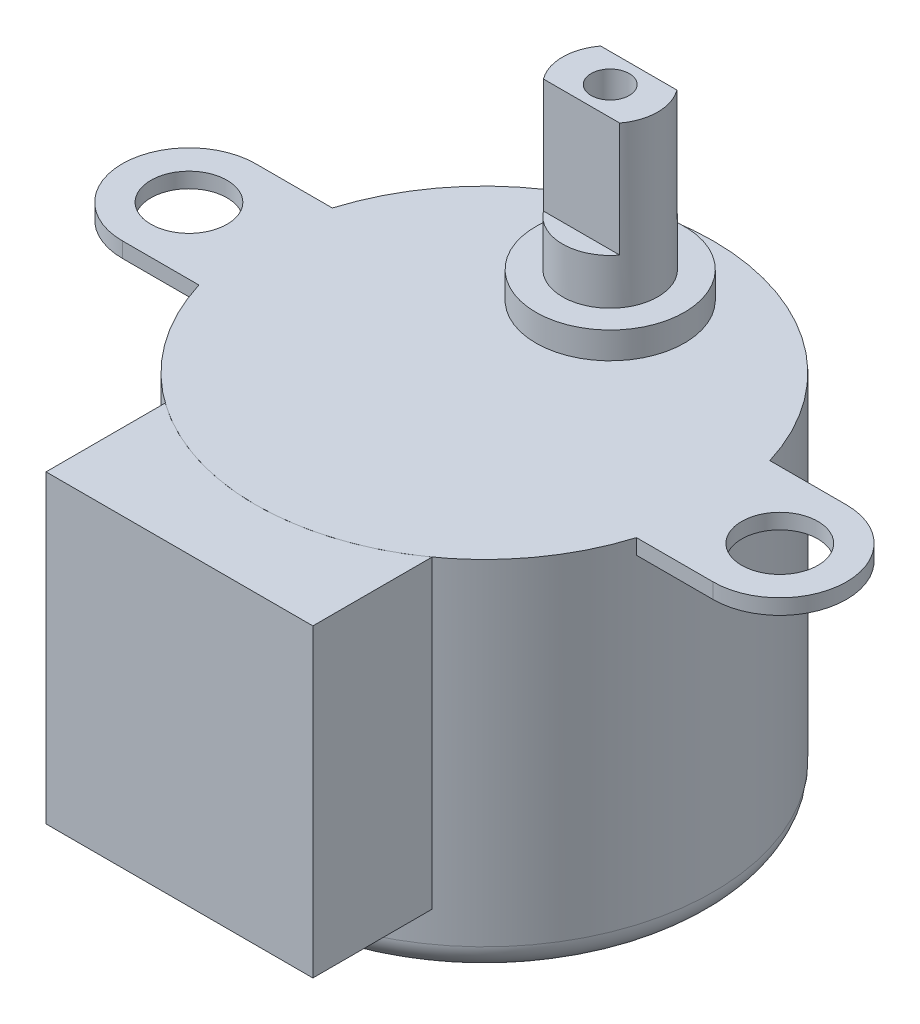
ISO-10303-21;
HEADER;
FILE_DESCRIPTION(('STEP AP214'),'2;1');
FILE_NAME('part.step','',(''),(''),'','','');
FILE_SCHEMA(('AUTOMOTIVE_DESIGN { 1 0 10303 214 1 1 1 1 }'));
ENDSEC;
DATA;
#1=APPLICATION_CONTEXT('core data for automotive mechanical design processes');
#2=APPLICATION_PROTOCOL_DEFINITION('international standard','automotive_design',2000,#1);
#3=PRODUCT_CONTEXT('',#1,'mechanical');
#4=PRODUCT('Part','Part','',(#3));
#5=PRODUCT_RELATED_PRODUCT_CATEGORY('part','',(#4));
#6=PRODUCT_DEFINITION_FORMATION('','',#4);
#7=PRODUCT_DEFINITION_CONTEXT('part definition',#1,'design');
#8=PRODUCT_DEFINITION('design','',#6,#7);
#9=PRODUCT_DEFINITION_SHAPE('','',#8);
#10=(LENGTH_UNIT() NAMED_UNIT(*) SI_UNIT(.MILLI.,.METRE.));
#11=(NAMED_UNIT(*) PLANE_ANGLE_UNIT() SI_UNIT($,.RADIAN.));
#12=(NAMED_UNIT(*) SI_UNIT($,.STERADIAN.) SOLID_ANGLE_UNIT());
#13=UNCERTAINTY_MEASURE_WITH_UNIT(LENGTH_MEASURE(1.E-05),#10,'distance_accuracy_value','');
#14=(GEOMETRIC_REPRESENTATION_CONTEXT(3) GLOBAL_UNCERTAINTY_ASSIGNED_CONTEXT((#13)) GLOBAL_UNIT_ASSIGNED_CONTEXT((#10,
#11,#12)) REPRESENTATION_CONTEXT('',''));
#15=CARTESIAN_POINT('',(0.,0.,0.));
#16=DIRECTION('',(0.,0.,1.));
#17=DIRECTION('',(1.,0.,0.));
#18=AXIS2_PLACEMENT_3D('',#15,#16,#17);
#19=CARTESIAN_POINT('',(0.,28.8,-6.6));
#20=DIRECTION('',(0.,-1.,0.));
#21=DIRECTION('',(0.,0.,-1.));
#22=AXIS2_PLACEMENT_3D('',#19,#20,#21);
#23=CYLINDRICAL_SURFACE('',#22,2.5);
#24=CARTESIAN_POINT('',(0.,28.8,-6.6));
#25=DIRECTION('',(0.,1.,0.));
#26=DIRECTION('',(0.,0.,1.));
#27=AXIS2_PLACEMENT_3D('',#24,#25,#26);
#28=CIRCLE('',#27,2.5);
#29=CARTESIAN_POINT('',(-2.,28.8,-8.1));
#30=VERTEX_POINT('',#29);
#31=CARTESIAN_POINT('',(-2.,28.8,-5.1));
#32=VERTEX_POINT('',#31);
#33=EDGE_CURVE('E52',#30,#32,#28,.T.);
#34=ORIENTED_EDGE('',*,*,#33,.F.);
#35=DIRECTION('',(0.,1.,0.));
#36=VECTOR('',#35,1.);
#37=CARTESIAN_POINT('',(-2.,22.8,-8.1));
#38=LINE('',#37,#36);
#39=CARTESIAN_POINT('',(-2.,22.8,-8.1));
#40=VERTEX_POINT('',#39);
#41=EDGE_CURVE('E59',#40,#30,#38,.T.);
#42=ORIENTED_EDGE('',*,*,#41,.F.);
#43=CARTESIAN_POINT('',(0.,22.8,-6.6));
#44=DIRECTION('',(0.,1.,0.));
#45=DIRECTION('',(0.,0.,1.));
#46=AXIS2_PLACEMENT_3D('',#43,#44,#45);
#47=CIRCLE('',#46,2.5);
#48=CARTESIAN_POINT('',(2.,22.8,-8.1));
#49=VERTEX_POINT('',#48);
#50=EDGE_CURVE('E86',#49,#40,#47,.T.);
#51=ORIENTED_EDGE('',*,*,#50,.F.);
#52=DIRECTION('',(0.,1.,0.));
#53=VECTOR('',#52,1.);
#54=CARTESIAN_POINT('',(2.,22.8,-8.1));
#55=LINE('',#54,#53);
#56=CARTESIAN_POINT('',(2.,28.8,-8.1));
#57=VERTEX_POINT('',#56);
#58=EDGE_CURVE('E94',#49,#57,#55,.T.);
#59=ORIENTED_EDGE('',*,*,#58,.T.);
#60=CARTESIAN_POINT('',(2.,28.8,-5.1));
#61=VERTEX_POINT('',#60);
#62=EDGE_CURVE('E12',#61,#57,#28,.T.);
#63=ORIENTED_EDGE('',*,*,#62,.F.);
#64=DIRECTION('',(0.,1.,0.));
#65=VECTOR('',#64,1.);
#66=CARTESIAN_POINT('',(2.,22.8,-5.1));
#67=LINE('',#66,#65);
#68=CARTESIAN_POINT('',(2.,22.8,-5.1));
#69=VERTEX_POINT('',#68);
#70=EDGE_CURVE('E67',#69,#61,#67,.T.);
#71=ORIENTED_EDGE('',*,*,#70,.F.);
#72=CARTESIAN_POINT('',(0.,22.8,-6.6));
#73=DIRECTION('',(0.,1.,0.));
#74=DIRECTION('',(0.,0.,1.));
#75=AXIS2_PLACEMENT_3D('',#72,#73,#74);
#76=CIRCLE('',#75,2.5);
#77=CARTESIAN_POINT('',(-2.,22.8,-5.1));
#78=VERTEX_POINT('',#77);
#79=EDGE_CURVE('E106',#78,#69,#76,.T.);
#80=ORIENTED_EDGE('',*,*,#79,.F.);
#81=DIRECTION('',(0.,1.,0.));
#82=VECTOR('',#81,1.);
#83=CARTESIAN_POINT('',(-2.,22.8,-5.1));
#84=LINE('',#83,#82);
#85=EDGE_CURVE('E110',#78,#32,#84,.T.);
#86=ORIENTED_EDGE('',*,*,#85,.T.);
#87=EDGE_LOOP('',(#34,#42,#51,#59,#63,#71,#80,#86));
#88=FACE_BOUND('',#87,.T.);
#89=CARTESIAN_POINT('',(0.,20.4,-6.6));
#90=DIRECTION('',(0.,1.,0.));
#91=DIRECTION('',(0.,0.,1.));
#92=AXIS2_PLACEMENT_3D('',#89,#90,#91);
#93=CIRCLE('',#92,2.5);
#94=CARTESIAN_POINT('',(0.,20.4,-4.1));
#95=VERTEX_POINT('',#94);
#96=EDGE_CURVE('E47',#95,#95,#93,.T.);
#97=ORIENTED_EDGE('',*,*,#96,.T.);
#98=EDGE_LOOP('',(#97));
#99=FACE_BOUND('',#98,.T.);
#100=ADVANCED_FACE('F44',(#88,#99),#23,.T.);
#101=CARTESIAN_POINT('',(0.,28.8,-6.6));
#102=DIRECTION('',(0.,1.,0.));
#103=DIRECTION('',(0.,0.,1.));
#104=AXIS2_PLACEMENT_3D('',#101,#102,#103);
#105=PLANE('',#104);
#106=CARTESIAN_POINT('',(0.,28.8,-6.6));
#107=DIRECTION('',(0.,1.,0.));
#108=DIRECTION('',(0.,0.,1.));
#109=AXIS2_PLACEMENT_3D('',#106,#107,#108);
#110=CIRCLE('',#109,1.);
#111=CARTESIAN_POINT('',(0.,28.8,-5.6));
#112=VERTEX_POINT('',#111);
#113=EDGE_CURVE('E200',#112,#112,#110,.T.);
#114=ORIENTED_EDGE('',*,*,#113,.F.);
#115=EDGE_LOOP('',(#114));
#116=FACE_BOUND('',#115,.T.);
#117=DIRECTION('',(1.,0.,0.));
#118=VECTOR('',#117,1.);
#119=CARTESIAN_POINT('',(0.,28.8,-8.1));
#120=LINE('',#119,#118);
#121=EDGE_CURVE('E91',#30,#57,#120,.T.);
#122=ORIENTED_EDGE('',*,*,#121,.F.);
#123=ORIENTED_EDGE('',*,*,#33,.T.);
#124=DIRECTION('',(1.,0.,0.));
#125=VECTOR('',#124,1.);
#126=CARTESIAN_POINT('',(0.,28.8,-5.1));
#127=LINE('',#126,#125);
#128=EDGE_CURVE('E107',#32,#61,#127,.T.);
#129=ORIENTED_EDGE('',*,*,#128,.T.);
#130=ORIENTED_EDGE('',*,*,#62,.T.);
#131=EDGE_LOOP('',(#122,#123,#129,#130));
#132=FACE_BOUND('',#131,.T.);
#133=ADVANCED_FACE('F117',(#116,#132),#105,.T.);
#134=CARTESIAN_POINT('',(0.,20.4,-6.6));
#135=DIRECTION('',(0.,1.,0.));
#136=DIRECTION('',(0.,0.,1.));
#137=AXIS2_PLACEMENT_3D('',#134,#135,#136);
#138=PLANE('',#137);
#139=ORIENTED_EDGE('',*,*,#96,.F.);
#140=EDGE_LOOP('',(#139));
#141=FACE_BOUND('',#140,.T.);
#142=ADVANCED_FACE('F122',(#141),#138,.F.);
#143=CARTESIAN_POINT('',(0.,22.8,-5.1));
#144=DIRECTION('',(0.,0.,1.));
#145=DIRECTION('',(1.,0.,0.));
#146=AXIS2_PLACEMENT_3D('',#143,#144,#145);
#147=PLANE('',#146);
#148=ORIENTED_EDGE('',*,*,#128,.F.);
#149=ORIENTED_EDGE('',*,*,#85,.F.);
#150=DIRECTION('',(1.,0.,0.));
#151=VECTOR('',#150,1.);
#152=CARTESIAN_POINT('',(0.,22.8,-5.1));
#153=LINE('',#152,#151);
#154=EDGE_CURVE('E104',#78,#69,#153,.T.);
#155=ORIENTED_EDGE('',*,*,#154,.T.);
#156=ORIENTED_EDGE('',*,*,#70,.T.);
#157=EDGE_LOOP('',(#148,#149,#155,#156));
#158=FACE_BOUND('',#157,.T.);
#159=ADVANCED_FACE('F124',(#158),#147,.T.);
#160=CARTESIAN_POINT('',(0.,22.8,0.));
#161=DIRECTION('',(0.,1.,0.));
#162=DIRECTION('',(0.,0.,1.));
#163=AXIS2_PLACEMENT_3D('',#160,#161,#162);
#164=PLANE('',#163);
#165=ORIENTED_EDGE('',*,*,#154,.F.);
#166=ORIENTED_EDGE('',*,*,#79,.T.);
#167=EDGE_LOOP('',(#165,#166));
#168=FACE_BOUND('',#167,.T.);
#169=ADVANCED_FACE('F129',(#168),#164,.T.);
#170=CARTESIAN_POINT('',(0.,22.8,-8.1));
#171=DIRECTION('',(0.,0.,1.));
#172=DIRECTION('',(1.,0.,0.));
#173=AXIS2_PLACEMENT_3D('',#170,#171,#172);
#174=PLANE('',#173);
#175=ORIENTED_EDGE('',*,*,#121,.T.);
#176=ORIENTED_EDGE('',*,*,#58,.F.);
#177=DIRECTION('',(1.,0.,0.));
#178=VECTOR('',#177,1.);
#179=CARTESIAN_POINT('',(0.,22.8,-8.1));
#180=LINE('',#179,#178);
#181=EDGE_CURVE('E88',#40,#49,#180,.T.);
#182=ORIENTED_EDGE('',*,*,#181,.F.);
#183=ORIENTED_EDGE('',*,*,#41,.T.);
#184=EDGE_LOOP('',(#175,#176,#182,#183));
#185=FACE_BOUND('',#184,.T.);
#186=ADVANCED_FACE('F93',(#185),#174,.F.);
#187=CARTESIAN_POINT('',(0.,22.8,0.));
#188=DIRECTION('',(0.,1.,0.));
#189=DIRECTION('',(0.,0.,1.));
#190=AXIS2_PLACEMENT_3D('',#187,#188,#189);
#191=PLANE('',#190);
#192=ORIENTED_EDGE('',*,*,#50,.T.);
#193=ORIENTED_EDGE('',*,*,#181,.T.);
#194=EDGE_LOOP('',(#192,#193));
#195=FACE_BOUND('',#194,.T.);
#196=ADVANCED_FACE('F87',(#195),#191,.T.);
#197=CARTESIAN_POINT('',(0.,22.8,-6.6));
#198=DIRECTION('',(0.,1.,0.));
#199=DIRECTION('',(0.,0.,1.));
#200=AXIS2_PLACEMENT_3D('',#197,#198,#199);
#201=CYLINDRICAL_SURFACE('',#200,1.);
#202=CARTESIAN_POINT('',(0.,22.8,-6.6));
#203=DIRECTION('',(0.,1.,0.));
#204=DIRECTION('',(0.,0.,1.));
#205=AXIS2_PLACEMENT_3D('',#202,#203,#204);
#206=CIRCLE('',#205,1.);
#207=CARTESIAN_POINT('',(0.,22.8,-5.6));
#208=VERTEX_POINT('',#207);
#209=EDGE_CURVE('E112',#208,#208,#206,.T.);
#210=ORIENTED_EDGE('',*,*,#209,.F.);
#211=EDGE_LOOP('',(#210));
#212=FACE_BOUND('',#211,.T.);
#213=ORIENTED_EDGE('',*,*,#113,.T.);
#214=EDGE_LOOP('',(#213));
#215=FACE_BOUND('',#214,.T.);
#216=ADVANCED_FACE('F152',(#212,#215),#201,.F.);
#217=CARTESIAN_POINT('',(0.,22.8,-6.6));
#218=DIRECTION('',(0.,1.,0.));
#219=DIRECTION('',(0.,0.,1.));
#220=AXIS2_PLACEMENT_3D('',#217,#218,#219);
#221=PLANE('',#220);
#222=ORIENTED_EDGE('',*,*,#209,.T.);
#223=EDGE_LOOP('',(#222));
#224=FACE_BOUND('',#223,.T.);
#225=ADVANCED_FACE('F157',(#224),#221,.T.);
#226=CLOSED_SHELL('',(#100,#133,#142,#159,#169,#186,#196,#216,#225));
#227=MANIFOLD_SOLID_BREP('B2',#226);
#228=CARTESIAN_POINT('',(7.,3.,0.));
#229=DIRECTION('',(-1.,0.,0.));
#230=DIRECTION('',(0.,0.,1.));
#231=AXIS2_PLACEMENT_3D('',#228,#229,#230);
#232=PLANE('',#231);
#233=DIRECTION('',(0.,0.,1.));
#234=VECTOR('',#233,1.);
#235=CARTESIAN_POINT('',(7.,19.,0.));
#236=LINE('',#235,#234);
#237=CARTESIAN_POINT('',(7.,19.,9.74679434480896));
#238=VERTEX_POINT('',#237);
#239=CARTESIAN_POINT('',(7.,19.,16.));
#240=VERTEX_POINT('',#239);
#241=EDGE_CURVE('E283',#238,#240,#236,.T.);
#242=ORIENTED_EDGE('',*,*,#241,.T.);
#243=DIRECTION('',(0.,1.,0.));
#244=VECTOR('',#243,1.);
#245=CARTESIAN_POINT('',(7.,3.,16.));
#246=LINE('',#245,#244);
#247=CARTESIAN_POINT('',(7.,3.,16.));
#248=VERTEX_POINT('',#247);
#249=EDGE_CURVE('E42',#248,#240,#246,.T.);
#250=ORIENTED_EDGE('',*,*,#249,.F.);
#251=DIRECTION('',(0.,0.,1.));
#252=VECTOR('',#251,1.);
#253=CARTESIAN_POINT('',(7.,3.,0.));
#254=LINE('',#253,#252);
#255=CARTESIAN_POINT('',(7.,3.,9.74679434480896));
#256=VERTEX_POINT('',#255);
#257=EDGE_CURVE('E239',#256,#248,#254,.T.);
#258=ORIENTED_EDGE('',*,*,#257,.F.);
#259=DIRECTION('',(0.,1.,0.));
#260=VECTOR('',#259,1.);
#261=CARTESIAN_POINT('',(7.,3.,9.74679434480896));
#262=LINE('',#261,#260);
#263=EDGE_CURVE('E224',#256,#238,#262,.T.);
#264=ORIENTED_EDGE('',*,*,#263,.T.);
#265=EDGE_LOOP('',(#242,#250,#258,#264));
#266=FACE_BOUND('',#265,.T.);
#267=ADVANCED_FACE('F221',(#266),#232,.F.);
#268=CARTESIAN_POINT('',(0.,3.,16.));
#269=DIRECTION('',(0.,0.,1.));
#270=DIRECTION('',(1.,0.,0.));
#271=AXIS2_PLACEMENT_3D('',#268,#269,#270);
#272=PLANE('',#271);
#273=DIRECTION('',(1.,0.,0.));
#274=VECTOR('',#273,1.);
#275=CARTESIAN_POINT('',(0.,19.,16.));
#276=LINE('',#275,#274);
#277=CARTESIAN_POINT('',(-7.,19.,16.));
#278=VERTEX_POINT('',#277);
#279=EDGE_CURVE('E288',#278,#240,#276,.T.);
#280=ORIENTED_EDGE('',*,*,#279,.F.);
#281=DIRECTION('',(0.,1.,0.));
#282=VECTOR('',#281,1.);
#283=CARTESIAN_POINT('',(-7.,3.,16.));
#284=LINE('',#283,#282);
#285=CARTESIAN_POINT('',(-7.,3.,16.));
#286=VERTEX_POINT('',#285);
#287=EDGE_CURVE('E230',#286,#278,#284,.T.);
#288=ORIENTED_EDGE('',*,*,#287,.F.);
#289=DIRECTION('',(1.,0.,0.));
#290=VECTOR('',#289,1.);
#291=CARTESIAN_POINT('',(0.,3.,16.));
#292=LINE('',#291,#290);
#293=EDGE_CURVE('E278',#286,#248,#292,.T.);
#294=ORIENTED_EDGE('',*,*,#293,.T.);
#295=ORIENTED_EDGE('',*,*,#249,.T.);
#296=EDGE_LOOP('',(#280,#288,#294,#295));
#297=FACE_BOUND('',#296,.T.);
#298=ADVANCED_FACE('F294',(#297),#272,.T.);
#299=CARTESIAN_POINT('',(-7.,3.,0.));
#300=DIRECTION('',(-1.,0.,0.));
#301=DIRECTION('',(0.,0.,1.));
#302=AXIS2_PLACEMENT_3D('',#299,#300,#301);
#303=PLANE('',#302);
#304=DIRECTION('',(0.,0.,1.));
#305=VECTOR('',#304,1.);
#306=CARTESIAN_POINT('',(-7.,19.,0.));
#307=LINE('',#306,#305);
#308=CARTESIAN_POINT('',(-7.,19.,9.74679434480896));
#309=VERTEX_POINT('',#308);
#310=EDGE_CURVE('E271',#309,#278,#307,.T.);
#311=ORIENTED_EDGE('',*,*,#310,.F.);
#312=DIRECTION('',(0.,1.,0.));
#313=VECTOR('',#312,1.);
#314=CARTESIAN_POINT('',(-7.,3.,9.74679434480896));
#315=LINE('',#314,#313);
#316=CARTESIAN_POINT('',(-7.,3.,9.74679434480896));
#317=VERTEX_POINT('',#316);
#318=EDGE_CURVE('E268',#317,#309,#315,.T.);
#319=ORIENTED_EDGE('',*,*,#318,.F.);
#320=DIRECTION('',(0.,0.,1.));
#321=VECTOR('',#320,1.);
#322=CARTESIAN_POINT('',(-7.,3.,0.));
#323=LINE('',#322,#321);
#324=EDGE_CURVE('E270',#317,#286,#323,.T.);
#325=ORIENTED_EDGE('',*,*,#324,.T.);
#326=ORIENTED_EDGE('',*,*,#287,.T.);
#327=EDGE_LOOP('',(#311,#319,#325,#326));
#328=FACE_BOUND('',#327,.T.);
#329=ADVANCED_FACE('F269',(#328),#303,.T.);
#330=CARTESIAN_POINT('',(0.,3.,0.));
#331=DIRECTION('',(0.,1.,0.));
#332=DIRECTION('',(0.,0.,1.));
#333=AXIS2_PLACEMENT_3D('',#330,#331,#332);
#334=CYLINDRICAL_SURFACE('',#333,12.);
#335=CARTESIAN_POINT('',(0.,19.,0.));
#336=DIRECTION('',(0.,1.,0.));
#337=DIRECTION('',(0.,0.,1.));
#338=AXIS2_PLACEMENT_3D('',#335,#336,#337);
#339=CIRCLE('',#338,12.);
#340=EDGE_CURVE('E285',#309,#238,#339,.T.);
#341=ORIENTED_EDGE('',*,*,#340,.T.);
#342=ORIENTED_EDGE('',*,*,#263,.F.);
#343=CARTESIAN_POINT('',(0.,3.,0.));
#344=DIRECTION('',(0.,1.,0.));
#345=DIRECTION('',(0.,0.,1.));
#346=AXIS2_PLACEMENT_3D('',#343,#344,#345);
#347=CIRCLE('',#346,12.);
#348=EDGE_CURVE('E265',#317,#256,#347,.T.);
#349=ORIENTED_EDGE('',*,*,#348,.F.);
#350=ORIENTED_EDGE('',*,*,#318,.T.);
#351=EDGE_LOOP('',(#341,#342,#349,#350));
#352=FACE_BOUND('',#351,.T.);
#353=ADVANCED_FACE('F274',(#352),#334,.F.);
#354=CARTESIAN_POINT('',(0.,3.,0.));
#355=DIRECTION('',(0.,1.,0.));
#356=DIRECTION('',(0.,0.,1.));
#357=AXIS2_PLACEMENT_3D('',#354,#355,#356);
#358=PLANE('',#357);
#359=ORIENTED_EDGE('',*,*,#257,.T.);
#360=ORIENTED_EDGE('',*,*,#293,.F.);
#361=ORIENTED_EDGE('',*,*,#324,.F.);
#362=ORIENTED_EDGE('',*,*,#348,.T.);
#363=EDGE_LOOP('',(#359,#360,#361,#362));
#364=FACE_BOUND('',#363,.T.);
#365=ADVANCED_FACE('F277',(#364),#358,.F.);
#366=CARTESIAN_POINT('',(0.,19.,0.));
#367=DIRECTION('',(0.,1.,0.));
#368=DIRECTION('',(0.,0.,1.));
#369=AXIS2_PLACEMENT_3D('',#366,#367,#368);
#370=PLANE('',#369);
#371=ORIENTED_EDGE('',*,*,#241,.F.);
#372=ORIENTED_EDGE('',*,*,#340,.F.);
#373=ORIENTED_EDGE('',*,*,#310,.T.);
#374=ORIENTED_EDGE('',*,*,#279,.T.);
#375=EDGE_LOOP('',(#371,#372,#373,#374));
#376=FACE_BOUND('',#375,.T.);
#377=ADVANCED_FACE('F293',(#376),#370,.T.);
#378=CLOSED_SHELL('',(#267,#298,#329,#353,#365,#377));
#379=MANIFOLD_SOLID_BREP('B6',#378);
#380=CARTESIAN_POINT('',(0.,19.,0.));
#381=DIRECTION('',(0.,-1.,0.));
#382=DIRECTION('',(0.,0.,-1.));
#383=AXIS2_PLACEMENT_3D('',#380,#381,#382);
#384=CYLINDRICAL_SURFACE('',#383,12.);
#385=CARTESIAN_POINT('',(0.,1.4,0.));
#386=DIRECTION('',(0.,1.,0.));
#387=DIRECTION('',(0.,0.,1.));
#388=AXIS2_PLACEMENT_3D('',#385,#386,#387);
#389=CIRCLE('',#388,12.);
#390=CARTESIAN_POINT('',(0.,1.4,12.));
#391=VERTEX_POINT('',#390);
#392=EDGE_CURVE('E353',#391,#391,#389,.T.);
#393=ORIENTED_EDGE('',*,*,#392,.T.);
#394=EDGE_LOOP('',(#393));
#395=FACE_BOUND('',#394,.T.);
#396=DIRECTION('',(0.,-1.,0.));
#397=VECTOR('',#396,1.);
#398=CARTESIAN_POINT('',(11.478240283249,19.,-3.50000000000001));
#399=LINE('',#398,#397);
#400=CARTESIAN_POINT('',(11.478240283249,18.2,-3.50000000000001));
#401=VERTEX_POINT('',#400);
#402=CARTESIAN_POINT('',(11.478240283249,19.,-3.50000000000001));
#403=VERTEX_POINT('',#402);
#404=EDGE_CURVE('E464',#401,#403,#399,.F.);
#405=ORIENTED_EDGE('',*,*,#404,.F.);
#406=CARTESIAN_POINT('',(0.,18.2,0.));
#407=DIRECTION('',(0.,1.,0.));
#408=DIRECTION('',(0.,0.,1.));
#409=AXIS2_PLACEMENT_3D('',#406,#407,#408);
#410=CIRCLE('',#409,12.);
#411=CARTESIAN_POINT('',(11.478240283249,18.2,3.50000000000001));
#412=VERTEX_POINT('',#411);
#413=EDGE_CURVE('E472',#412,#401,#410,.T.);
#414=ORIENTED_EDGE('',*,*,#413,.F.);
#415=DIRECTION('',(0.,-1.,0.));
#416=VECTOR('',#415,1.);
#417=CARTESIAN_POINT('',(11.478240283249,19.,3.50000000000001));
#418=LINE('',#417,#416);
#419=CARTESIAN_POINT('',(11.478240283249,19.,3.50000000000001));
#420=VERTEX_POINT('',#419);
#421=EDGE_CURVE('E454',#412,#420,#418,.F.);
#422=ORIENTED_EDGE('',*,*,#421,.T.);
#423=CARTESIAN_POINT('',(0.,19.,0.));
#424=DIRECTION('',(0.,1.,0.));
#425=DIRECTION('',(0.,0.,1.));
#426=AXIS2_PLACEMENT_3D('',#423,#424,#425);
#427=CIRCLE('',#426,12.);
#428=CARTESIAN_POINT('',(-11.478240283249,19.,3.50000000000001));
#429=VERTEX_POINT('',#428);
#430=EDGE_CURVE('E468',#429,#420,#427,.T.);
#431=ORIENTED_EDGE('',*,*,#430,.F.);
#432=DIRECTION('',(0.,-1.,0.));
#433=VECTOR('',#432,1.);
#434=CARTESIAN_POINT('',(-11.478240283249,19.,3.50000000000001));
#435=LINE('',#434,#433);
#436=CARTESIAN_POINT('',(-11.478240283249,18.2,3.50000000000001));
#437=VERTEX_POINT('',#436);
#438=EDGE_CURVE('E462',#429,#437,#435,.T.);
#439=ORIENTED_EDGE('',*,*,#438,.T.);
#440=CARTESIAN_POINT('',(-11.478240283249,18.2,-3.49999999999999));
#441=VERTEX_POINT('',#440);
#442=EDGE_CURVE('E428',#441,#437,#410,.T.);
#443=ORIENTED_EDGE('',*,*,#442,.F.);
#444=DIRECTION('',(0.,-1.,0.));
#445=VECTOR('',#444,1.);
#446=CARTESIAN_POINT('',(-11.478240283249,19.,-3.49999999999999));
#447=LINE('',#446,#445);
#448=CARTESIAN_POINT('',(-11.478240283249,19.,-3.49999999999999));
#449=VERTEX_POINT('',#448);
#450=EDGE_CURVE('E466',#449,#441,#447,.T.);
#451=ORIENTED_EDGE('',*,*,#450,.F.);
#452=EDGE_CURVE('E470',#403,#449,#427,.T.);
#453=ORIENTED_EDGE('',*,*,#452,.F.);
#454=EDGE_LOOP('',(#405,#414,#422,#431,#439,#443,#451,#453));
#455=FACE_BOUND('',#454,.T.);
#456=ADVANCED_FACE('F345',(#395,#455),#384,.T.);
#457=CARTESIAN_POINT('',(0.,19.,0.));
#458=DIRECTION('',(0.,1.,0.));
#459=DIRECTION('',(0.,0.,1.));
#460=AXIS2_PLACEMENT_3D('',#457,#458,#459);
#461=PLANE('',#460);
#462=CARTESIAN_POINT('',(0.,19.,-6.6));
#463=DIRECTION('',(0.,1.,0.));
#464=DIRECTION('',(0.,0.,1.));
#465=AXIS2_PLACEMENT_3D('',#462,#463,#464);
#466=CIRCLE('',#465,3.9);
#467=CARTESIAN_POINT('',(0.,19.,-2.7));
#468=VERTEX_POINT('',#467);
#469=EDGE_CURVE('E704',#468,#468,#466,.T.);
#470=ORIENTED_EDGE('',*,*,#469,.F.);
#471=EDGE_LOOP('',(#470));
#472=FACE_BOUND('',#471,.T.);
#473=CARTESIAN_POINT('',(15.5,19.,0.));
#474=DIRECTION('',(0.,1.,0.));
#475=DIRECTION('',(0.,0.,1.));
#476=AXIS2_PLACEMENT_3D('',#473,#474,#475);
#477=CIRCLE('',#476,2.);
#478=CARTESIAN_POINT('',(15.5,19.,2.));
#479=VERTEX_POINT('',#478);
#480=EDGE_CURVE('E476',#479,#479,#477,.T.);
#481=ORIENTED_EDGE('',*,*,#480,.F.);
#482=EDGE_LOOP('',(#481));
#483=FACE_BOUND('',#482,.T.);
#484=CARTESIAN_POINT('',(-15.5,19.,0.));
#485=DIRECTION('',(0.,1.,0.));
#486=DIRECTION('',(0.,0.,1.));
#487=AXIS2_PLACEMENT_3D('',#484,#485,#486);
#488=CIRCLE('',#487,2.);
#489=CARTESIAN_POINT('',(-15.5,19.,2.00000000000001));
#490=VERTEX_POINT('',#489);
#491=EDGE_CURVE('E439',#490,#490,#488,.T.);
#492=ORIENTED_EDGE('',*,*,#491,.F.);
#493=EDGE_LOOP('',(#492));
#494=FACE_BOUND('',#493,.T.);
#495=ORIENTED_EDGE('',*,*,#430,.T.);
#496=DIRECTION('',(1.,0.,0.));
#497=VECTOR('',#496,1.);
#498=CARTESIAN_POINT('',(0.,19.,3.50000000000001));
#499=LINE('',#498,#497);
#500=CARTESIAN_POINT('',(15.5,19.,3.50000000000001));
#501=VERTEX_POINT('',#500);
#502=EDGE_CURVE('E448',#420,#501,#499,.T.);
#503=ORIENTED_EDGE('',*,*,#502,.T.);
#504=CARTESIAN_POINT('',(15.5,19.,0.));
#505=DIRECTION('',(0.,1.,0.));
#506=DIRECTION('',(0.,0.,1.));
#507=AXIS2_PLACEMENT_3D('',#504,#505,#506);
#508=CIRCLE('',#507,3.5);
#509=CARTESIAN_POINT('',(15.5,19.,-3.50000000000001));
#510=VERTEX_POINT('',#509);
#511=EDGE_CURVE('E451',#501,#510,#508,.T.);
#512=ORIENTED_EDGE('',*,*,#511,.T.);
#513=DIRECTION('',(1.,0.,0.));
#514=VECTOR('',#513,1.);
#515=CARTESIAN_POINT('',(0.,19.,-3.5));
#516=LINE('',#515,#514);
#517=EDGE_CURVE('E367',#403,#510,#516,.T.);
#518=ORIENTED_EDGE('',*,*,#517,.F.);
#519=ORIENTED_EDGE('',*,*,#452,.T.);
#520=CARTESIAN_POINT('',(-15.5,19.,-3.49999999999999));
#521=VERTEX_POINT('',#520);
#522=EDGE_CURVE('E435',#521,#449,#516,.T.);
#523=ORIENTED_EDGE('',*,*,#522,.F.);
#524=CARTESIAN_POINT('',(-15.5,19.,0.));
#525=DIRECTION('',(0.,1.,0.));
#526=DIRECTION('',(0.,0.,1.));
#527=AXIS2_PLACEMENT_3D('',#524,#525,#526);
#528=CIRCLE('',#527,3.5);
#529=CARTESIAN_POINT('',(-15.5,19.,3.50000000000001));
#530=VERTEX_POINT('',#529);
#531=EDGE_CURVE('E446',#521,#530,#528,.T.);
#532=ORIENTED_EDGE('',*,*,#531,.T.);
#533=EDGE_CURVE('E360',#530,#429,#499,.T.);
#534=ORIENTED_EDGE('',*,*,#533,.T.);
#535=EDGE_LOOP('',(#495,#503,#512,#518,#519,#523,#532,#534));
#536=FACE_BOUND('',#535,.T.);
#537=ADVANCED_FACE('F495',(#472,#483,#494,#536),#461,.T.);
#538=CARTESIAN_POINT('',(0.,0.,0.));
#539=DIRECTION('',(0.,1.,0.));
#540=DIRECTION('',(0.,0.,1.));
#541=AXIS2_PLACEMENT_3D('',#538,#539,#540);
#542=PLANE('',#541);
#543=CARTESIAN_POINT('',(0.,0.,0.));
#544=DIRECTION('',(0.,1.,0.));
#545=DIRECTION('',(0.,0.,1.));
#546=AXIS2_PLACEMENT_3D('',#543,#544,#545);
#547=CIRCLE('',#546,10.6);
#548=CARTESIAN_POINT('',(0.,0.,10.6));
#549=VERTEX_POINT('',#548);
#550=EDGE_CURVE('E219',#549,#549,#547,.F.);
#551=ORIENTED_EDGE('',*,*,#550,.T.);
#552=EDGE_LOOP('',(#551));
#553=FACE_BOUND('',#552,.T.);
#554=ADVANCED_FACE('F521',(#553),#542,.F.);
#555=CARTESIAN_POINT('',(-15.5,18.2,0.));
#556=DIRECTION('',(0.,1.,0.));
#557=DIRECTION('',(0.,0.,1.));
#558=AXIS2_PLACEMENT_3D('',#555,#556,#557);
#559=CYLINDRICAL_SURFACE('',#558,3.5);
#560=ORIENTED_EDGE('',*,*,#531,.F.);
#561=DIRECTION('',(0.,1.,0.));
#562=VECTOR('',#561,1.);
#563=CARTESIAN_POINT('',(-15.5,18.2,-3.49999999999999));
#564=LINE('',#563,#562);
#565=CARTESIAN_POINT('',(-15.5,18.2,-3.49999999999999));
#566=VERTEX_POINT('',#565);
#567=EDGE_CURVE('E433',#566,#521,#564,.T.);
#568=ORIENTED_EDGE('',*,*,#567,.F.);
#569=CARTESIAN_POINT('',(-15.5,18.2,0.));
#570=DIRECTION('',(0.,1.,0.));
#571=DIRECTION('',(0.,0.,1.));
#572=AXIS2_PLACEMENT_3D('',#569,#570,#571);
#573=CIRCLE('',#572,3.5);
#574=CARTESIAN_POINT('',(-15.5,18.2,3.50000000000001));
#575=VERTEX_POINT('',#574);
#576=EDGE_CURVE('E426',#566,#575,#573,.T.);
#577=ORIENTED_EDGE('',*,*,#576,.T.);
#578=DIRECTION('',(0.,1.,0.));
#579=VECTOR('',#578,1.);
#580=CARTESIAN_POINT('',(-15.5,18.2,3.50000000000001));
#581=LINE('',#580,#579);
#582=EDGE_CURVE('E411',#575,#530,#581,.T.);
#583=ORIENTED_EDGE('',*,*,#582,.T.);
#584=EDGE_LOOP('',(#560,#568,#577,#583));
#585=FACE_BOUND('',#584,.T.);
#586=ADVANCED_FACE('F432',(#585),#559,.T.);
#587=CARTESIAN_POINT('',(0.,18.2,0.));
#588=DIRECTION('',(0.,1.,0.));
#589=DIRECTION('',(0.,0.,1.));
#590=AXIS2_PLACEMENT_3D('',#587,#588,#589);
#591=PLANE('',#590);
#592=CARTESIAN_POINT('',(-15.5,18.2,0.));
#593=DIRECTION('',(0.,1.,0.));
#594=DIRECTION('',(0.,0.,1.));
#595=AXIS2_PLACEMENT_3D('',#592,#593,#594);
#596=CIRCLE('',#595,2.);
#597=CARTESIAN_POINT('',(-15.5,18.2,2.00000000000001));
#598=VERTEX_POINT('',#597);
#599=EDGE_CURVE('E449',#598,#598,#596,.T.);
#600=ORIENTED_EDGE('',*,*,#599,.T.);
#601=EDGE_LOOP('',(#600));
#602=FACE_BOUND('',#601,.T.);
#603=DIRECTION('',(1.,0.,0.));
#604=VECTOR('',#603,1.);
#605=CARTESIAN_POINT('',(0.,18.2,-3.5));
#606=LINE('',#605,#604);
#607=EDGE_CURVE('E420',#566,#441,#606,.T.);
#608=ORIENTED_EDGE('',*,*,#607,.T.);
#609=ORIENTED_EDGE('',*,*,#442,.T.);
#610=DIRECTION('',(1.,0.,0.));
#611=VECTOR('',#610,1.);
#612=CARTESIAN_POINT('',(0.,18.2,3.50000000000001));
#613=LINE('',#612,#611);
#614=EDGE_CURVE('E414',#575,#437,#613,.T.);
#615=ORIENTED_EDGE('',*,*,#614,.F.);
#616=ORIENTED_EDGE('',*,*,#576,.F.);
#617=EDGE_LOOP('',(#608,#609,#615,#616));
#618=FACE_BOUND('',#617,.T.);
#619=ADVANCED_FACE('F425',(#602,#618),#591,.F.);
#620=CARTESIAN_POINT('',(0.,18.2,3.50000000000001));
#621=DIRECTION('',(0.,0.,1.));
#622=DIRECTION('',(1.,0.,0.));
#623=AXIS2_PLACEMENT_3D('',#620,#621,#622);
#624=PLANE('',#623);
#625=ORIENTED_EDGE('',*,*,#438,.F.);
#626=ORIENTED_EDGE('',*,*,#533,.F.);
#627=ORIENTED_EDGE('',*,*,#582,.F.);
#628=ORIENTED_EDGE('',*,*,#614,.T.);
#629=EDGE_LOOP('',(#625,#626,#627,#628));
#630=FACE_BOUND('',#629,.T.);
#631=ADVANCED_FACE('F413',(#630),#624,.T.);
#632=CARTESIAN_POINT('',(0.,18.2,-3.5));
#633=DIRECTION('',(0.,0.,1.));
#634=DIRECTION('',(1.,0.,0.));
#635=AXIS2_PLACEMENT_3D('',#632,#633,#634);
#636=PLANE('',#635);
#637=ORIENTED_EDGE('',*,*,#522,.T.);
#638=ORIENTED_EDGE('',*,*,#450,.T.);
#639=ORIENTED_EDGE('',*,*,#607,.F.);
#640=ORIENTED_EDGE('',*,*,#567,.T.);
#641=EDGE_LOOP('',(#637,#638,#639,#640));
#642=FACE_BOUND('',#641,.T.);
#643=ADVANCED_FACE('F497',(#642),#636,.F.);
#644=CARTESIAN_POINT('',(15.5,18.2,0.));
#645=DIRECTION('',(0.,1.,0.));
#646=DIRECTION('',(0.,0.,1.));
#647=AXIS2_PLACEMENT_3D('',#644,#645,#646);
#648=CIRCLE('',#647,2.);
#649=CARTESIAN_POINT('',(15.5,18.2,2.));
#650=VERTEX_POINT('',#649);
#651=EDGE_CURVE('E473',#650,#650,#648,.T.);
#652=ORIENTED_EDGE('',*,*,#651,.T.);
#653=EDGE_LOOP('',(#652));
#654=FACE_BOUND('',#653,.T.);
#655=CARTESIAN_POINT('',(15.5,18.2,3.50000000000001));
#656=VERTEX_POINT('',#655);
#657=EDGE_CURVE('E430',#412,#656,#613,.T.);
#658=ORIENTED_EDGE('',*,*,#657,.F.);
#659=ORIENTED_EDGE('',*,*,#413,.T.);
#660=CARTESIAN_POINT('',(15.5,18.2,-3.50000000000001));
#661=VERTEX_POINT('',#660);
#662=EDGE_CURVE('E444',#401,#661,#606,.T.);
#663=ORIENTED_EDGE('',*,*,#662,.T.);
#664=CARTESIAN_POINT('',(15.5,18.2,0.));
#665=DIRECTION('',(0.,1.,0.));
#666=DIRECTION('',(0.,0.,1.));
#667=AXIS2_PLACEMENT_3D('',#664,#665,#666);
#668=CIRCLE('',#667,3.5);
#669=EDGE_CURVE('E429',#656,#661,#668,.T.);
#670=ORIENTED_EDGE('',*,*,#669,.F.);
#671=EDGE_LOOP('',(#658,#659,#663,#670));
#672=FACE_BOUND('',#671,.T.);
#673=ADVANCED_FACE('F485',(#654,#672),#591,.F.);
#674=ORIENTED_EDGE('',*,*,#662,.F.);
#675=ORIENTED_EDGE('',*,*,#404,.T.);
#676=ORIENTED_EDGE('',*,*,#517,.T.);
#677=DIRECTION('',(0.,1.,0.));
#678=VECTOR('',#677,1.);
#679=CARTESIAN_POINT('',(15.5,18.2,-3.50000000000001));
#680=LINE('',#679,#678);
#681=EDGE_CURVE('E455',#661,#510,#680,.T.);
#682=ORIENTED_EDGE('',*,*,#681,.F.);
#683=EDGE_LOOP('',(#674,#675,#676,#682));
#684=FACE_BOUND('',#683,.T.);
#685=ADVANCED_FACE('F491',(#684),#636,.F.);
#686=ORIENTED_EDGE('',*,*,#421,.F.);
#687=ORIENTED_EDGE('',*,*,#657,.T.);
#688=DIRECTION('',(0.,1.,0.));
#689=VECTOR('',#688,1.);
#690=CARTESIAN_POINT('',(15.5,18.2,3.50000000000001));
#691=LINE('',#690,#689);
#692=EDGE_CURVE('E419',#656,#501,#691,.T.);
#693=ORIENTED_EDGE('',*,*,#692,.T.);
#694=ORIENTED_EDGE('',*,*,#502,.F.);
#695=EDGE_LOOP('',(#686,#687,#693,#694));
#696=FACE_BOUND('',#695,.T.);
#697=ADVANCED_FACE('F502',(#696),#624,.T.);
#698=CARTESIAN_POINT('',(15.5,18.2,0.));
#699=DIRECTION('',(0.,1.,0.));
#700=DIRECTION('',(0.,0.,1.));
#701=AXIS2_PLACEMENT_3D('',#698,#699,#700);
#702=CYLINDRICAL_SURFACE('',#701,3.5);
#703=ORIENTED_EDGE('',*,*,#511,.F.);
#704=ORIENTED_EDGE('',*,*,#692,.F.);
#705=ORIENTED_EDGE('',*,*,#669,.T.);
#706=ORIENTED_EDGE('',*,*,#681,.T.);
#707=EDGE_LOOP('',(#703,#704,#705,#706));
#708=FACE_BOUND('',#707,.T.);
#709=ADVANCED_FACE('F504',(#708),#702,.T.);
#710=CARTESIAN_POINT('',(15.5,0.,0.));
#711=DIRECTION('',(0.,1.,0.));
#712=DIRECTION('',(0.,0.,1.));
#713=AXIS2_PLACEMENT_3D('',#710,#711,#712);
#714=CYLINDRICAL_SURFACE('',#713,2.);
#715=ORIENTED_EDGE('',*,*,#480,.T.);
#716=EDGE_LOOP('',(#715));
#717=FACE_BOUND('',#716,.T.);
#718=ORIENTED_EDGE('',*,*,#651,.F.);
#719=EDGE_LOOP('',(#718));
#720=FACE_BOUND('',#719,.T.);
#721=ADVANCED_FACE('F506',(#717,#720),#714,.F.);
#722=CARTESIAN_POINT('',(-15.5,0.,0.));
#723=DIRECTION('',(0.,1.,0.));
#724=DIRECTION('',(0.,0.,1.));
#725=AXIS2_PLACEMENT_3D('',#722,#723,#724);
#726=CYLINDRICAL_SURFACE('',#725,2.);
#727=ORIENTED_EDGE('',*,*,#491,.T.);
#728=EDGE_LOOP('',(#727));
#729=FACE_BOUND('',#728,.T.);
#730=ORIENTED_EDGE('',*,*,#599,.F.);
#731=EDGE_LOOP('',(#730));
#732=FACE_BOUND('',#731,.T.);
#733=ADVANCED_FACE('F512',(#729,#732),#726,.F.);
#734=CARTESIAN_POINT('',(0.,20.4,-6.6));
#735=DIRECTION('',(0.,-1.,0.));
#736=DIRECTION('',(0.,0.,-1.));
#737=AXIS2_PLACEMENT_3D('',#734,#735,#736);
#738=CYLINDRICAL_SURFACE('',#737,3.9);
#739=CARTESIAN_POINT('',(0.,20.4,-6.6));
#740=DIRECTION('',(0.,1.,0.));
#741=DIRECTION('',(0.,0.,1.));
#742=AXIS2_PLACEMENT_3D('',#739,#740,#741);
#743=CIRCLE('',#742,3.9);
#744=CARTESIAN_POINT('',(0.,20.4,-2.7));
#745=VERTEX_POINT('',#744);
#746=EDGE_CURVE('E703',#745,#745,#743,.T.);
#747=ORIENTED_EDGE('',*,*,#746,.F.);
#748=EDGE_LOOP('',(#747));
#749=FACE_BOUND('',#748,.T.);
#750=ORIENTED_EDGE('',*,*,#469,.T.);
#751=EDGE_LOOP('',(#750));
#752=FACE_BOUND('',#751,.T.);
#753=ADVANCED_FACE('F583',(#749,#752),#738,.T.);
#754=CARTESIAN_POINT('',(0.,20.4,-6.6));
#755=DIRECTION('',(0.,1.,0.));
#756=DIRECTION('',(0.,0.,1.));
#757=AXIS2_PLACEMENT_3D('',#754,#755,#756);
#758=PLANE('',#757);
#759=ORIENTED_EDGE('',*,*,#746,.T.);
#760=EDGE_LOOP('',(#759));
#761=FACE_BOUND('',#760,.T.);
#762=ADVANCED_FACE('F600',(#761),#758,.T.);
#763=CARTESIAN_POINT('',(0.,1.4,0.));
#764=DIRECTION('',(0.,1.,0.));
#765=DIRECTION('',(0.,0.,1.));
#766=AXIS2_PLACEMENT_3D('',#763,#764,#765);
#767=TOROIDAL_SURFACE('',#766,10.6,1.4);
#768=ORIENTED_EDGE('',*,*,#550,.F.);
#769=EDGE_LOOP('',(#768));
#770=FACE_BOUND('',#769,.T.);
#771=ORIENTED_EDGE('',*,*,#392,.F.);
#772=EDGE_LOOP('',(#771));
#773=FACE_BOUND('',#772,.T.);
#774=ADVANCED_FACE('F347',(#770,#773),#767,.T.);
#775=CLOSED_SHELL('',(#456,#537,#554,#586,#619,#631,#643,#673,#685,#697,#709,#721,#733,#753,
#762,#774));
#776=MANIFOLD_SOLID_BREP('B36',#775);
#777=ADVANCED_BREP_SHAPE_REPRESENTATION('',(#18,#227,#379,#776),#14);
#778=SHAPE_DEFINITION_REPRESENTATION(#9,#777);
ENDSEC;
END-ISO-10303-21;
